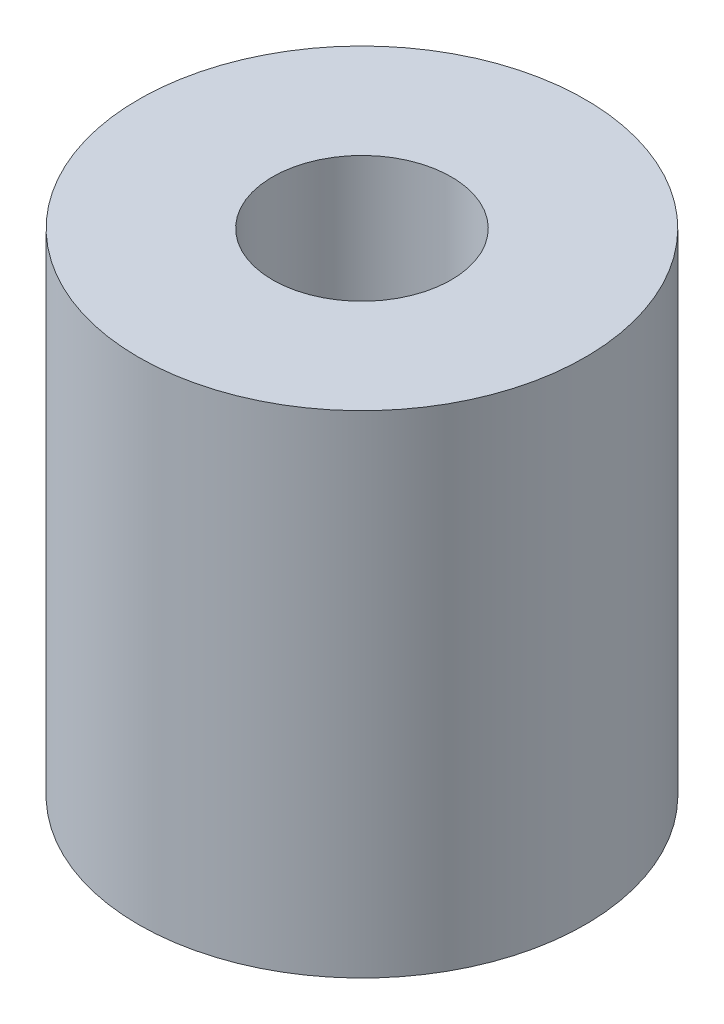
ISO-10303-21;
HEADER;
FILE_DESCRIPTION(('STEP AP214'),'2;1');
FILE_NAME('part.step','',(''),(''),'','','');
FILE_SCHEMA(('AUTOMOTIVE_DESIGN { 1 0 10303 214 1 1 1 1 }'));
ENDSEC;
DATA;
#1=APPLICATION_CONTEXT('core data for automotive mechanical design processes');
#2=APPLICATION_PROTOCOL_DEFINITION('international standard','automotive_design',2000,#1);
#3=PRODUCT_CONTEXT('',#1,'mechanical');
#4=PRODUCT('Part','Part','',(#3));
#5=PRODUCT_RELATED_PRODUCT_CATEGORY('part','',(#4));
#6=PRODUCT_DEFINITION_FORMATION('','',#4);
#7=PRODUCT_DEFINITION_CONTEXT('part definition',#1,'design');
#8=PRODUCT_DEFINITION('design','',#6,#7);
#9=PRODUCT_DEFINITION_SHAPE('','',#8);
#10=(LENGTH_UNIT() NAMED_UNIT(*) SI_UNIT(.MILLI.,.METRE.));
#11=(NAMED_UNIT(*) PLANE_ANGLE_UNIT() SI_UNIT($,.RADIAN.));
#12=(NAMED_UNIT(*) SI_UNIT($,.STERADIAN.) SOLID_ANGLE_UNIT());
#13=UNCERTAINTY_MEASURE_WITH_UNIT(LENGTH_MEASURE(1.E-05),#10,'distance_accuracy_value','');
#14=(GEOMETRIC_REPRESENTATION_CONTEXT(3) GLOBAL_UNCERTAINTY_ASSIGNED_CONTEXT((#13)) GLOBAL_UNIT_ASSIGNED_CONTEXT((#10,
#11,#12)) REPRESENTATION_CONTEXT('',''));
#15=CARTESIAN_POINT('',(0.,0.,0.));
#16=DIRECTION('',(0.,0.,1.));
#17=DIRECTION('',(1.,0.,0.));
#18=AXIS2_PLACEMENT_3D('',#15,#16,#17);
#19=CARTESIAN_POINT('',(0.,5.5,0.));
#20=DIRECTION('',(0.,1.,0.));
#21=DIRECTION('',(0.,0.,1.));
#22=AXIS2_PLACEMENT_3D('',#19,#20,#21);
#23=PLANE('',#22);
#24=CARTESIAN_POINT('',(0.,5.5,0.));
#25=DIRECTION('',(0.,1.,0.));
#26=DIRECTION('',(0.,0.,1.));
#27=AXIS2_PLACEMENT_3D('',#24,#25,#26);
#28=CIRCLE('',#27,2.5);
#29=CARTESIAN_POINT('',(0.,5.5,2.5));
#30=VERTEX_POINT('',#29);
#31=EDGE_CURVE('E10',#30,#30,#28,.T.);
#32=ORIENTED_EDGE('',*,*,#31,.T.);
#33=EDGE_LOOP('',(#32));
#34=FACE_BOUND('',#33,.T.);
#35=CARTESIAN_POINT('',(0.,5.5,0.));
#36=DIRECTION('',(0.,1.,0.));
#37=DIRECTION('',(0.,0.,1.));
#38=AXIS2_PLACEMENT_3D('',#35,#36,#37);
#39=CIRCLE('',#38,1.);
#40=CARTESIAN_POINT('',(0.,5.5,1.));
#41=VERTEX_POINT('',#40);
#42=EDGE_CURVE('E42',#41,#41,#39,.T.);
#43=ORIENTED_EDGE('',*,*,#42,.F.);
#44=EDGE_LOOP('',(#43));
#45=FACE_BOUND('',#44,.T.);
#46=ADVANCED_FACE('F31',(#34,#45),#23,.T.);
#47=CARTESIAN_POINT('',(0.,0.,0.));
#48=DIRECTION('',(0.,1.,0.));
#49=DIRECTION('',(0.,0.,1.));
#50=AXIS2_PLACEMENT_3D('',#47,#48,#49);
#51=PLANE('',#50);
#52=CARTESIAN_POINT('',(0.,0.,0.));
#53=DIRECTION('',(0.,1.,0.));
#54=DIRECTION('',(0.,0.,1.));
#55=AXIS2_PLACEMENT_3D('',#52,#53,#54);
#56=CIRCLE('',#55,2.5);
#57=CARTESIAN_POINT('',(0.,0.,2.5));
#58=VERTEX_POINT('',#57);
#59=EDGE_CURVE('E35',#58,#58,#56,.T.);
#60=ORIENTED_EDGE('',*,*,#59,.F.);
#61=EDGE_LOOP('',(#60));
#62=FACE_BOUND('',#61,.T.);
#63=CARTESIAN_POINT('',(0.,0.,0.));
#64=DIRECTION('',(0.,1.,0.));
#65=DIRECTION('',(0.,0.,1.));
#66=AXIS2_PLACEMENT_3D('',#63,#64,#65);
#67=CIRCLE('',#66,1.);
#68=CARTESIAN_POINT('',(0.,0.,1.));
#69=VERTEX_POINT('',#68);
#70=EDGE_CURVE('E44',#69,#69,#67,.T.);
#71=ORIENTED_EDGE('',*,*,#70,.T.);
#72=EDGE_LOOP('',(#71));
#73=FACE_BOUND('',#72,.T.);
#74=ADVANCED_FACE('F54',(#62,#73),#51,.F.);
#75=CARTESIAN_POINT('',(0.,5.5,0.));
#76=DIRECTION('',(0.,-1.,0.));
#77=DIRECTION('',(0.,0.,-1.));
#78=AXIS2_PLACEMENT_3D('',#75,#76,#77);
#79=CYLINDRICAL_SURFACE('',#78,2.5);
#80=ORIENTED_EDGE('',*,*,#31,.F.);
#81=EDGE_LOOP('',(#80));
#82=FACE_BOUND('',#81,.T.);
#83=ORIENTED_EDGE('',*,*,#59,.T.);
#84=EDGE_LOOP('',(#83));
#85=FACE_BOUND('',#84,.T.);
#86=ADVANCED_FACE('F33',(#82,#85),#79,.T.);
#87=CARTESIAN_POINT('',(0.,5.5,0.));
#88=DIRECTION('',(0.,-1.,0.));
#89=DIRECTION('',(0.,0.,-1.));
#90=AXIS2_PLACEMENT_3D('',#87,#88,#89);
#91=CYLINDRICAL_SURFACE('',#90,1.);
#92=ORIENTED_EDGE('',*,*,#42,.T.);
#93=EDGE_LOOP('',(#92));
#94=FACE_BOUND('',#93,.T.);
#95=ORIENTED_EDGE('',*,*,#70,.F.);
#96=EDGE_LOOP('',(#95));
#97=FACE_BOUND('',#96,.T.);
#98=ADVANCED_FACE('F50',(#94,#97),#91,.F.);
#99=CLOSED_SHELL('',(#46,#74,#86,#98));
#100=MANIFOLD_SOLID_BREP('B2',#99);
#101=ADVANCED_BREP_SHAPE_REPRESENTATION('',(#18,#100),#14);
#102=SHAPE_DEFINITION_REPRESENTATION(#9,#101);
ENDSEC;
END-ISO-10303-21;
